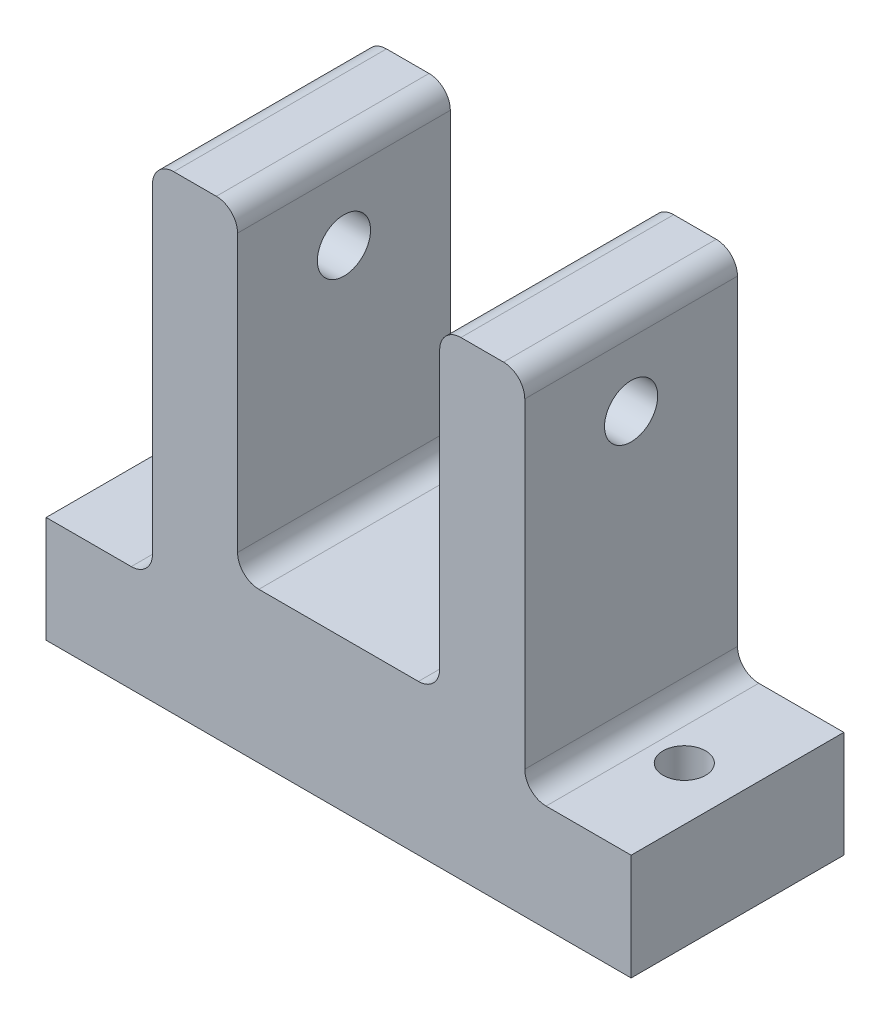
ISO-10303-21;
HEADER;
FILE_DESCRIPTION(('STEP AP214'),'2;1');
FILE_NAME('part.step','',(''),(''),'','','');
FILE_SCHEMA(('AUTOMOTIVE_DESIGN { 1 0 10303 214 1 1 1 1 }'));
ENDSEC;
DATA;
#1=APPLICATION_CONTEXT('core data for automotive mechanical design processes');
#2=APPLICATION_PROTOCOL_DEFINITION('international standard','automotive_design',2000,#1);
#3=PRODUCT_CONTEXT('',#1,'mechanical');
#4=PRODUCT('Part','Part','',(#3));
#5=PRODUCT_RELATED_PRODUCT_CATEGORY('part','',(#4));
#6=PRODUCT_DEFINITION_FORMATION('','',#4);
#7=PRODUCT_DEFINITION_CONTEXT('part definition',#1,'design');
#8=PRODUCT_DEFINITION('design','',#6,#7);
#9=PRODUCT_DEFINITION_SHAPE('','',#8);
#10=(LENGTH_UNIT() NAMED_UNIT(*) SI_UNIT(.MILLI.,.METRE.));
#11=(NAMED_UNIT(*) PLANE_ANGLE_UNIT() SI_UNIT($,.RADIAN.));
#12=(NAMED_UNIT(*) SI_UNIT($,.STERADIAN.) SOLID_ANGLE_UNIT());
#13=UNCERTAINTY_MEASURE_WITH_UNIT(LENGTH_MEASURE(1.E-05),#10,'distance_accuracy_value','');
#14=(GEOMETRIC_REPRESENTATION_CONTEXT(3) GLOBAL_UNCERTAINTY_ASSIGNED_CONTEXT((#13)) GLOBAL_UNIT_ASSIGNED_CONTEXT((#10,
#11,#12)) REPRESENTATION_CONTEXT('',''));
#15=CARTESIAN_POINT('',(0.,0.,0.));
#16=DIRECTION('',(0.,0.,1.));
#17=DIRECTION('',(1.,0.,0.));
#18=AXIS2_PLACEMENT_3D('',#15,#16,#17);
#19=CARTESIAN_POINT('',(0.,44.15,0.));
#20=DIRECTION('',(0.,-1.,0.));
#21=DIRECTION('',(0.,0.,-1.));
#22=AXIS2_PLACEMENT_3D('',#19,#20,#21);
#23=PLANE('',#22);
#24=DIRECTION('',(1.,0.,0.));
#25=VECTOR('',#24,1.);
#26=CARTESIAN_POINT('',(-17.5,44.15,10.));
#27=LINE('',#26,#25);
#28=CARTESIAN_POINT('',(11.5,44.15,10.));
#29=VERTEX_POINT('',#28);
#30=CARTESIAN_POINT('',(15.5,44.15,10.));
#31=VERTEX_POINT('',#30);
#32=EDGE_CURVE('E268',#29,#31,#27,.T.);
#33=ORIENTED_EDGE('',*,*,#32,.T.);
#34=DIRECTION('',(0.,0.,-1.));
#35=VECTOR('',#34,1.);
#36=CARTESIAN_POINT('',(15.5,44.15,0.));
#37=LINE('',#36,#35);
#38=CARTESIAN_POINT('',(15.5,44.15,-10.));
#39=VERTEX_POINT('',#38);
#40=EDGE_CURVE('E324',#31,#39,#37,.T.);
#41=ORIENTED_EDGE('',*,*,#40,.T.);
#42=DIRECTION('',(-1.,0.,0.));
#43=VECTOR('',#42,1.);
#44=CARTESIAN_POINT('',(-17.5,44.15,-10.));
#45=LINE('',#44,#43);
#46=CARTESIAN_POINT('',(11.5,44.15,-10.));
#47=VERTEX_POINT('',#46);
#48=EDGE_CURVE('E266',#39,#47,#45,.T.);
#49=ORIENTED_EDGE('',*,*,#48,.T.);
#50=DIRECTION('',(0.,0.,-1.));
#51=VECTOR('',#50,1.);
#52=CARTESIAN_POINT('',(11.5,44.15,0.));
#53=LINE('',#52,#51);
#54=EDGE_CURVE('E296',#47,#29,#53,.F.);
#55=ORIENTED_EDGE('',*,*,#54,.T.);
#56=EDGE_LOOP('',(#33,#41,#49,#55));
#57=FACE_BOUND('',#56,.T.);
#58=ADVANCED_FACE('F41',(#57),#23,.F.);
#59=CARTESIAN_POINT('',(17.5,44.15,10.));
#60=DIRECTION('',(-1.,0.,0.));
#61=DIRECTION('',(0.,0.,1.));
#62=AXIS2_PLACEMENT_3D('',#59,#60,#61);
#63=PLANE('',#62);
#64=CARTESIAN_POINT('',(17.5,36.15,0.));
#65=DIRECTION('',(-1.,0.,0.));
#66=DIRECTION('',(0.,0.,1.));
#67=AXIS2_PLACEMENT_3D('',#64,#65,#66);
#68=CIRCLE('',#67,2.5);
#69=CARTESIAN_POINT('',(17.5,36.15,2.5));
#70=VERTEX_POINT('',#69);
#71=EDGE_CURVE('E246',#70,#70,#68,.T.);
#72=ORIENTED_EDGE('',*,*,#71,.T.);
#73=EDGE_LOOP('',(#72));
#74=FACE_BOUND('',#73,.T.);
#75=DIRECTION('',(0.,-1.,0.));
#76=VECTOR('',#75,1.);
#77=CARTESIAN_POINT('',(17.5,44.15,-10.));
#78=LINE('',#77,#76);
#79=CARTESIAN_POINT('',(17.5,42.15,-10.));
#80=VERTEX_POINT('',#79);
#81=CARTESIAN_POINT('',(17.5,12.,-10.));
#82=VERTEX_POINT('',#81);
#83=EDGE_CURVE('E281',#80,#82,#78,.T.);
#84=ORIENTED_EDGE('',*,*,#83,.F.);
#85=DIRECTION('',(0.,0.,-1.));
#86=VECTOR('',#85,1.);
#87=CARTESIAN_POINT('',(17.5,42.15,10.));
#88=LINE('',#87,#86);
#89=CARTESIAN_POINT('',(17.5,42.15,10.));
#90=VERTEX_POINT('',#89);
#91=EDGE_CURVE('E334',#80,#90,#88,.F.);
#92=ORIENTED_EDGE('',*,*,#91,.T.);
#93=DIRECTION('',(0.,-1.,0.));
#94=VECTOR('',#93,1.);
#95=CARTESIAN_POINT('',(17.5,44.15,10.));
#96=LINE('',#95,#94);
#97=CARTESIAN_POINT('',(17.5,12.,10.));
#98=VERTEX_POINT('',#97);
#99=EDGE_CURVE('E271',#90,#98,#96,.T.);
#100=ORIENTED_EDGE('',*,*,#99,.T.);
#101=DIRECTION('',(0.,0.,-1.));
#102=VECTOR('',#101,1.);
#103=CARTESIAN_POINT('',(17.5,12.,-10.));
#104=LINE('',#103,#102);
#105=EDGE_CURVE('E331',#98,#82,#104,.T.);
#106=ORIENTED_EDGE('',*,*,#105,.T.);
#107=EDGE_LOOP('',(#84,#92,#100,#106));
#108=FACE_BOUND('',#107,.T.);
#109=ADVANCED_FACE('F362',(#74,#108),#63,.F.);
#110=CARTESIAN_POINT('',(-17.5,44.15,-10.));
#111=DIRECTION('',(0.,0.,1.));
#112=DIRECTION('',(1.,0.,0.));
#113=AXIS2_PLACEMENT_3D('',#110,#111,#112);
#114=PLANE('',#113);
#115=ORIENTED_EDGE('',*,*,#48,.F.);
#116=CARTESIAN_POINT('',(15.5,42.15,-10.));
#117=DIRECTION('',(0.,0.,1.));
#118=DIRECTION('',(1.,0.,0.));
#119=AXIS2_PLACEMENT_3D('',#116,#117,#118);
#120=CIRCLE('',#119,2.);
#121=EDGE_CURVE('E329',#39,#80,#120,.F.);
#122=ORIENTED_EDGE('',*,*,#121,.T.);
#123=ORIENTED_EDGE('',*,*,#83,.T.);
#124=CARTESIAN_POINT('',(19.5,12.,-10.));
#125=DIRECTION('',(0.,0.,1.));
#126=DIRECTION('',(1.,0.,0.));
#127=AXIS2_PLACEMENT_3D('',#124,#125,#126);
#128=CIRCLE('',#127,2.);
#129=CARTESIAN_POINT('',(19.5,10.,-10.));
#130=VERTEX_POINT('',#129);
#131=EDGE_CURVE('E351',#82,#130,#128,.T.);
#132=ORIENTED_EDGE('',*,*,#131,.T.);
#133=DIRECTION('',(1.,0.,0.));
#134=VECTOR('',#133,1.);
#135=CARTESIAN_POINT('',(17.5,10.,-10.));
#136=LINE('',#135,#134);
#137=CARTESIAN_POINT('',(27.5,10.,-10.));
#138=VERTEX_POINT('',#137);
#139=EDGE_CURVE('E227',#130,#138,#136,.T.);
#140=ORIENTED_EDGE('',*,*,#139,.T.);
#141=DIRECTION('',(0.,-1.,0.));
#142=VECTOR('',#141,1.);
#143=CARTESIAN_POINT('',(27.5,10.,-10.));
#144=LINE('',#143,#142);
#145=CARTESIAN_POINT('',(27.5,0.,-10.));
#146=VERTEX_POINT('',#145);
#147=EDGE_CURVE('E185',#138,#146,#144,.T.);
#148=ORIENTED_EDGE('',*,*,#147,.T.);
#149=DIRECTION('',(-1.,0.,0.));
#150=VECTOR('',#149,1.);
#151=CARTESIAN_POINT('',(-17.5,0.,-10.));
#152=LINE('',#151,#150);
#153=CARTESIAN_POINT('',(-27.5,0.,-10.));
#154=VERTEX_POINT('',#153);
#155=EDGE_CURVE('E177',#146,#154,#152,.T.);
#156=ORIENTED_EDGE('',*,*,#155,.T.);
#157=DIRECTION('',(0.,-1.,0.));
#158=VECTOR('',#157,1.);
#159=CARTESIAN_POINT('',(-27.5,10.,-10.));
#160=LINE('',#159,#158);
#161=CARTESIAN_POINT('',(-27.5,10.,-10.));
#162=VERTEX_POINT('',#161);
#163=EDGE_CURVE('E182',#162,#154,#160,.T.);
#164=ORIENTED_EDGE('',*,*,#163,.F.);
#165=DIRECTION('',(1.,0.,0.));
#166=VECTOR('',#165,1.);
#167=CARTESIAN_POINT('',(-17.5,10.,-10.));
#168=LINE('',#167,#166);
#169=CARTESIAN_POINT('',(-19.5,10.,-10.));
#170=VERTEX_POINT('',#169);
#171=EDGE_CURVE('E215',#162,#170,#168,.T.);
#172=ORIENTED_EDGE('',*,*,#171,.T.);
#173=CARTESIAN_POINT('',(-19.5,12.,-10.));
#174=DIRECTION('',(0.,0.,1.));
#175=DIRECTION('',(1.,0.,0.));
#176=AXIS2_PLACEMENT_3D('',#173,#174,#175);
#177=CIRCLE('',#176,2.);
#178=CARTESIAN_POINT('',(-17.5,12.,-10.));
#179=VERTEX_POINT('',#178);
#180=EDGE_CURVE('E11',#170,#179,#177,.T.);
#181=ORIENTED_EDGE('',*,*,#180,.T.);
#182=DIRECTION('',(0.,-1.,0.));
#183=VECTOR('',#182,1.);
#184=CARTESIAN_POINT('',(-17.5,44.15,-10.));
#185=LINE('',#184,#183);
#186=CARTESIAN_POINT('',(-17.5,42.15,-10.));
#187=VERTEX_POINT('',#186);
#188=EDGE_CURVE('E278',#187,#179,#185,.T.);
#189=ORIENTED_EDGE('',*,*,#188,.F.);
#190=CARTESIAN_POINT('',(-15.5,42.15,-10.));
#191=DIRECTION('',(0.,0.,1.));
#192=DIRECTION('',(1.,0.,0.));
#193=AXIS2_PLACEMENT_3D('',#190,#191,#192);
#194=CIRCLE('',#193,2.);
#195=CARTESIAN_POINT('',(-15.5,44.15,-10.));
#196=VERTEX_POINT('',#195);
#197=EDGE_CURVE('E327',#187,#196,#194,.F.);
#198=ORIENTED_EDGE('',*,*,#197,.T.);
#199=CARTESIAN_POINT('',(-11.5,44.15,-10.));
#200=VERTEX_POINT('',#199);
#201=EDGE_CURVE('E269',#200,#196,#45,.T.);
#202=ORIENTED_EDGE('',*,*,#201,.F.);
#203=CARTESIAN_POINT('',(-11.5,42.15,-10.));
#204=DIRECTION('',(0.,0.,1.));
#205=DIRECTION('',(1.,0.,0.));
#206=AXIS2_PLACEMENT_3D('',#203,#204,#205);
#207=CIRCLE('',#206,2.);
#208=CARTESIAN_POINT('',(-9.5,42.15,-10.));
#209=VERTEX_POINT('',#208);
#210=EDGE_CURVE('E291',#200,#209,#207,.F.);
#211=ORIENTED_EDGE('',*,*,#210,.T.);
#212=DIRECTION('',(0.,1.,0.));
#213=VECTOR('',#212,1.);
#214=CARTESIAN_POINT('',(-9.5,14.15,-10.));
#215=LINE('',#214,#213);
#216=CARTESIAN_POINT('',(-9.5,16.15,-10.));
#217=VERTEX_POINT('',#216);
#218=EDGE_CURVE('E261',#217,#209,#215,.T.);
#219=ORIENTED_EDGE('',*,*,#218,.F.);
#220=CARTESIAN_POINT('',(-7.5,16.15,-10.));
#221=DIRECTION('',(0.,0.,1.));
#222=DIRECTION('',(1.,0.,0.));
#223=AXIS2_PLACEMENT_3D('',#220,#221,#222);
#224=CIRCLE('',#223,2.);
#225=CARTESIAN_POINT('',(-7.5,14.15,-10.));
#226=VERTEX_POINT('',#225);
#227=EDGE_CURVE('E322',#217,#226,#224,.T.);
#228=ORIENTED_EDGE('',*,*,#227,.T.);
#229=DIRECTION('',(-1.,0.,0.));
#230=VECTOR('',#229,1.);
#231=CARTESIAN_POINT('',(-9.5,14.15,-10.));
#232=LINE('',#231,#230);
#233=CARTESIAN_POINT('',(7.5,14.15,-10.));
#234=VERTEX_POINT('',#233);
#235=EDGE_CURVE('E249',#234,#226,#232,.T.);
#236=ORIENTED_EDGE('',*,*,#235,.F.);
#237=CARTESIAN_POINT('',(7.5,16.15,-10.));
#238=DIRECTION('',(0.,0.,1.));
#239=DIRECTION('',(1.,0.,0.));
#240=AXIS2_PLACEMENT_3D('',#237,#238,#239);
#241=CIRCLE('',#240,2.);
#242=CARTESIAN_POINT('',(9.5,16.15,-10.));
#243=VERTEX_POINT('',#242);
#244=EDGE_CURVE('E316',#234,#243,#241,.T.);
#245=ORIENTED_EDGE('',*,*,#244,.T.);
#246=DIRECTION('',(0.,1.,0.));
#247=VECTOR('',#246,1.);
#248=CARTESIAN_POINT('',(9.5,14.15,-10.));
#249=LINE('',#248,#247);
#250=CARTESIAN_POINT('',(9.5,42.15,-10.));
#251=VERTEX_POINT('',#250);
#252=EDGE_CURVE('E255',#243,#251,#249,.T.);
#253=ORIENTED_EDGE('',*,*,#252,.T.);
#254=CARTESIAN_POINT('',(11.5,42.15,-10.));
#255=DIRECTION('',(0.,0.,1.));
#256=DIRECTION('',(1.,0.,0.));
#257=AXIS2_PLACEMENT_3D('',#254,#255,#256);
#258=CIRCLE('',#257,2.);
#259=EDGE_CURVE('E293',#251,#47,#258,.F.);
#260=ORIENTED_EDGE('',*,*,#259,.T.);
#261=EDGE_LOOP('',(#115,#122,#123,#132,#140,#148,#156,#164,#172,#181,#189,#198,#202,#211,#219,
#228,#236,#245,#253,#260));
#262=FACE_BOUND('',#261,.T.);
#263=ADVANCED_FACE('F180',(#262),#114,.F.);
#264=CARTESIAN_POINT('',(-17.5,44.15,10.));
#265=DIRECTION('',(1.,0.,0.));
#266=DIRECTION('',(0.,0.,-1.));
#267=AXIS2_PLACEMENT_3D('',#264,#265,#266);
#268=PLANE('',#267);
#269=CARTESIAN_POINT('',(-17.5,36.15,0.));
#270=DIRECTION('',(1.,0.,0.));
#271=DIRECTION('',(0.,0.,-1.));
#272=AXIS2_PLACEMENT_3D('',#269,#270,#271);
#273=CIRCLE('',#272,2.5);
#274=CARTESIAN_POINT('',(-17.5,36.15,-2.5));
#275=VERTEX_POINT('',#274);
#276=EDGE_CURVE('E238',#275,#275,#273,.T.);
#277=ORIENTED_EDGE('',*,*,#276,.T.);
#278=EDGE_LOOP('',(#277));
#279=FACE_BOUND('',#278,.T.);
#280=DIRECTION('',(0.,-1.,0.));
#281=VECTOR('',#280,1.);
#282=CARTESIAN_POINT('',(-17.5,44.15,10.));
#283=LINE('',#282,#281);
#284=CARTESIAN_POINT('',(-17.5,42.15,10.));
#285=VERTEX_POINT('',#284);
#286=CARTESIAN_POINT('',(-17.5,12.,10.));
#287=VERTEX_POINT('',#286);
#288=EDGE_CURVE('E276',#285,#287,#283,.T.);
#289=ORIENTED_EDGE('',*,*,#288,.F.);
#290=DIRECTION('',(0.,0.,1.));
#291=VECTOR('',#290,1.);
#292=CARTESIAN_POINT('',(-17.5,42.15,10.));
#293=LINE('',#292,#291);
#294=EDGE_CURVE('E346',#285,#187,#293,.F.);
#295=ORIENTED_EDGE('',*,*,#294,.T.);
#296=ORIENTED_EDGE('',*,*,#188,.T.);
#297=DIRECTION('',(0.,0.,1.));
#298=VECTOR('',#297,1.);
#299=CARTESIAN_POINT('',(-17.5,12.,10.));
#300=LINE('',#299,#298);
#301=EDGE_CURVE('E343',#179,#287,#300,.T.);
#302=ORIENTED_EDGE('',*,*,#301,.T.);
#303=EDGE_LOOP('',(#289,#295,#296,#302));
#304=FACE_BOUND('',#303,.T.);
#305=ADVANCED_FACE('F378',(#279,#304),#268,.F.);
#306=CARTESIAN_POINT('',(-17.5,44.15,10.));
#307=DIRECTION('',(0.,0.,-1.));
#308=DIRECTION('',(-1.,0.,0.));
#309=AXIS2_PLACEMENT_3D('',#306,#307,#308);
#310=PLANE('',#309);
#311=ORIENTED_EDGE('',*,*,#99,.F.);
#312=CARTESIAN_POINT('',(15.5,42.15,10.));
#313=DIRECTION('',(0.,0.,-1.));
#314=DIRECTION('',(-1.,0.,0.));
#315=AXIS2_PLACEMENT_3D('',#312,#313,#314);
#316=CIRCLE('',#315,2.);
#317=EDGE_CURVE('E338',#90,#31,#316,.F.);
#318=ORIENTED_EDGE('',*,*,#317,.T.);
#319=ORIENTED_EDGE('',*,*,#32,.F.);
#320=CARTESIAN_POINT('',(11.5,42.15,10.));
#321=DIRECTION('',(0.,0.,-1.));
#322=DIRECTION('',(-1.,0.,0.));
#323=AXIS2_PLACEMENT_3D('',#320,#321,#322);
#324=CIRCLE('',#323,2.);
#325=CARTESIAN_POINT('',(9.5,42.15,10.));
#326=VERTEX_POINT('',#325);
#327=EDGE_CURVE('E301',#29,#326,#324,.F.);
#328=ORIENTED_EDGE('',*,*,#327,.T.);
#329=DIRECTION('',(0.,1.,0.));
#330=VECTOR('',#329,1.);
#331=CARTESIAN_POINT('',(9.5,14.15,10.));
#332=LINE('',#331,#330);
#333=CARTESIAN_POINT('',(9.5,16.15,10.));
#334=VERTEX_POINT('',#333);
#335=EDGE_CURVE('E191',#334,#326,#332,.T.);
#336=ORIENTED_EDGE('',*,*,#335,.F.);
#337=CARTESIAN_POINT('',(7.5,16.15,10.));
#338=DIRECTION('',(0.,0.,-1.));
#339=DIRECTION('',(-1.,0.,0.));
#340=AXIS2_PLACEMENT_3D('',#337,#338,#339);
#341=CIRCLE('',#340,2.);
#342=CARTESIAN_POINT('',(7.5,14.15,10.));
#343=VERTEX_POINT('',#342);
#344=EDGE_CURVE('E318',#334,#343,#341,.T.);
#345=ORIENTED_EDGE('',*,*,#344,.T.);
#346=DIRECTION('',(1.,0.,0.));
#347=VECTOR('',#346,1.);
#348=CARTESIAN_POINT('',(-9.5,14.15,10.));
#349=LINE('',#348,#347);
#350=CARTESIAN_POINT('',(-7.5,14.15,10.));
#351=VERTEX_POINT('',#350);
#352=EDGE_CURVE('E252',#351,#343,#349,.T.);
#353=ORIENTED_EDGE('',*,*,#352,.F.);
#354=CARTESIAN_POINT('',(-7.5,16.15,10.));
#355=DIRECTION('',(0.,0.,-1.));
#356=DIRECTION('',(-1.,0.,0.));
#357=AXIS2_PLACEMENT_3D('',#354,#355,#356);
#358=CIRCLE('',#357,2.);
#359=CARTESIAN_POINT('',(-9.5,16.15,10.));
#360=VERTEX_POINT('',#359);
#361=EDGE_CURVE('E320',#351,#360,#358,.T.);
#362=ORIENTED_EDGE('',*,*,#361,.T.);
#363=DIRECTION('',(0.,1.,0.));
#364=VECTOR('',#363,1.);
#365=CARTESIAN_POINT('',(-9.5,14.15,10.));
#366=LINE('',#365,#364);
#367=CARTESIAN_POINT('',(-9.5,42.15,10.));
#368=VERTEX_POINT('',#367);
#369=EDGE_CURVE('E258',#360,#368,#366,.T.);
#370=ORIENTED_EDGE('',*,*,#369,.T.);
#371=CARTESIAN_POINT('',(-11.5,42.15,10.));
#372=DIRECTION('',(0.,0.,-1.));
#373=DIRECTION('',(-1.,0.,0.));
#374=AXIS2_PLACEMENT_3D('',#371,#372,#373);
#375=CIRCLE('',#374,2.);
#376=CARTESIAN_POINT('',(-11.5,44.15,10.));
#377=VERTEX_POINT('',#376);
#378=EDGE_CURVE('E298',#368,#377,#375,.F.);
#379=ORIENTED_EDGE('',*,*,#378,.T.);
#380=CARTESIAN_POINT('',(-15.5,44.15,10.));
#381=VERTEX_POINT('',#380);
#382=EDGE_CURVE('E270',#381,#377,#27,.T.);
#383=ORIENTED_EDGE('',*,*,#382,.F.);
#384=CARTESIAN_POINT('',(-15.5,42.15,10.));
#385=DIRECTION('',(0.,0.,-1.));
#386=DIRECTION('',(-1.,0.,0.));
#387=AXIS2_PLACEMENT_3D('',#384,#385,#386);
#388=CIRCLE('',#387,2.);
#389=EDGE_CURVE('E336',#381,#285,#388,.F.);
#390=ORIENTED_EDGE('',*,*,#389,.T.);
#391=ORIENTED_EDGE('',*,*,#288,.T.);
#392=CARTESIAN_POINT('',(-19.5,12.,10.));
#393=DIRECTION('',(0.,0.,-1.));
#394=DIRECTION('',(-1.,0.,0.));
#395=AXIS2_PLACEMENT_3D('',#392,#393,#394);
#396=CIRCLE('',#395,2.);
#397=CARTESIAN_POINT('',(-19.5,10.,10.));
#398=VERTEX_POINT('',#397);
#399=EDGE_CURVE('E49',#287,#398,#396,.T.);
#400=ORIENTED_EDGE('',*,*,#399,.T.);
#401=DIRECTION('',(-1.,0.,0.));
#402=VECTOR('',#401,1.);
#403=CARTESIAN_POINT('',(-17.5,10.,10.));
#404=LINE('',#403,#402);
#405=CARTESIAN_POINT('',(-27.5,10.,10.));
#406=VERTEX_POINT('',#405);
#407=EDGE_CURVE('E207',#398,#406,#404,.T.);
#408=ORIENTED_EDGE('',*,*,#407,.T.);
#409=DIRECTION('',(0.,-1.,0.));
#410=VECTOR('',#409,1.);
#411=CARTESIAN_POINT('',(-27.5,10.,10.));
#412=LINE('',#411,#410);
#413=CARTESIAN_POINT('',(-27.5,0.,10.));
#414=VERTEX_POINT('',#413);
#415=EDGE_CURVE('E201',#406,#414,#412,.T.);
#416=ORIENTED_EDGE('',*,*,#415,.T.);
#417=DIRECTION('',(1.,0.,0.));
#418=VECTOR('',#417,1.);
#419=CARTESIAN_POINT('',(-17.5,0.,10.));
#420=LINE('',#419,#418);
#421=CARTESIAN_POINT('',(27.5,0.,10.));
#422=VERTEX_POINT('',#421);
#423=EDGE_CURVE('E190',#414,#422,#420,.T.);
#424=ORIENTED_EDGE('',*,*,#423,.T.);
#425=DIRECTION('',(0.,-1.,0.));
#426=VECTOR('',#425,1.);
#427=CARTESIAN_POINT('',(27.5,10.,10.));
#428=LINE('',#427,#426);
#429=CARTESIAN_POINT('',(27.5,10.,10.));
#430=VERTEX_POINT('',#429);
#431=EDGE_CURVE('E235',#430,#422,#428,.T.);
#432=ORIENTED_EDGE('',*,*,#431,.F.);
#433=DIRECTION('',(-1.,0.,0.));
#434=VECTOR('',#433,1.);
#435=CARTESIAN_POINT('',(17.5,10.,10.));
#436=LINE('',#435,#434);
#437=CARTESIAN_POINT('',(19.5,10.,10.));
#438=VERTEX_POINT('',#437);
#439=EDGE_CURVE('E232',#430,#438,#436,.T.);
#440=ORIENTED_EDGE('',*,*,#439,.T.);
#441=CARTESIAN_POINT('',(19.5,12.,10.));
#442=DIRECTION('',(0.,0.,-1.));
#443=DIRECTION('',(-1.,0.,0.));
#444=AXIS2_PLACEMENT_3D('',#441,#442,#443);
#445=CIRCLE('',#444,2.);
#446=EDGE_CURVE('E353',#438,#98,#445,.T.);
#447=ORIENTED_EDGE('',*,*,#446,.T.);
#448=EDGE_LOOP('',(#311,#318,#319,#328,#336,#345,#353,#362,#370,#379,#383,#390,#391,#400,#408,
#416,#424,#432,#440,#447));
#449=FACE_BOUND('',#448,.T.);
#450=ADVANCED_FACE('F356',(#449),#310,.F.);
#451=ORIENTED_EDGE('',*,*,#201,.T.);
#452=DIRECTION('',(0.,0.,1.));
#453=VECTOR('',#452,1.);
#454=CARTESIAN_POINT('',(-15.5,44.15,0.));
#455=LINE('',#454,#453);
#456=EDGE_CURVE('E340',#196,#381,#455,.T.);
#457=ORIENTED_EDGE('',*,*,#456,.T.);
#458=ORIENTED_EDGE('',*,*,#382,.T.);
#459=DIRECTION('',(0.,0.,1.));
#460=VECTOR('',#459,1.);
#461=CARTESIAN_POINT('',(-11.5,44.15,0.));
#462=LINE('',#461,#460);
#463=EDGE_CURVE('E308',#377,#200,#462,.F.);
#464=ORIENTED_EDGE('',*,*,#463,.T.);
#465=EDGE_LOOP('',(#451,#457,#458,#464));
#466=FACE_BOUND('',#465,.T.);
#467=ADVANCED_FACE('F387',(#466),#23,.F.);
#468=CARTESIAN_POINT('',(0.,0.,0.));
#469=DIRECTION('',(0.,-1.,0.));
#470=DIRECTION('',(0.,0.,-1.));
#471=AXIS2_PLACEMENT_3D('',#468,#469,#470);
#472=PLANE('',#471);
#473=ORIENTED_EDGE('',*,*,#155,.F.);
#474=DIRECTION('',(0.,0.,1.));
#475=VECTOR('',#474,1.);
#476=CARTESIAN_POINT('',(27.5,0.,10.));
#477=LINE('',#476,#475);
#478=EDGE_CURVE('E224',#146,#422,#477,.T.);
#479=ORIENTED_EDGE('',*,*,#478,.T.);
#480=ORIENTED_EDGE('',*,*,#423,.F.);
#481=DIRECTION('',(0.,0.,-1.));
#482=VECTOR('',#481,1.);
#483=CARTESIAN_POINT('',(-27.5,0.,10.));
#484=LINE('',#483,#482);
#485=EDGE_CURVE('E198',#414,#154,#484,.T.);
#486=ORIENTED_EDGE('',*,*,#485,.T.);
#487=EDGE_LOOP('',(#473,#479,#480,#486));
#488=FACE_BOUND('',#487,.T.);
#489=CARTESIAN_POINT('',(22.5,0.,0.));
#490=DIRECTION('',(0.,-1.,0.));
#491=DIRECTION('',(0.,0.,-1.));
#492=AXIS2_PLACEMENT_3D('',#489,#490,#491);
#493=CIRCLE('',#492,2.);
#494=CARTESIAN_POINT('',(22.5,0.,-2.));
#495=VERTEX_POINT('',#494);
#496=EDGE_CURVE('E219',#495,#495,#493,.T.);
#497=ORIENTED_EDGE('',*,*,#496,.F.);
#498=EDGE_LOOP('',(#497));
#499=FACE_BOUND('',#498,.T.);
#500=CARTESIAN_POINT('',(-22.5,0.,0.));
#501=DIRECTION('',(0.,-1.,0.));
#502=DIRECTION('',(0.,0.,1.));
#503=AXIS2_PLACEMENT_3D('',#500,#501,#502);
#504=CIRCLE('',#503,2.);
#505=CARTESIAN_POINT('',(-22.5,0.,2.));
#506=VERTEX_POINT('',#505);
#507=EDGE_CURVE('E210',#506,#506,#504,.T.);
#508=ORIENTED_EDGE('',*,*,#507,.F.);
#509=EDGE_LOOP('',(#508));
#510=FACE_BOUND('',#509,.T.);
#511=ADVANCED_FACE('F203',(#488,#499,#510),#472,.T.);
#512=CARTESIAN_POINT('',(9.5,14.15,10.));
#513=DIRECTION('',(1.,0.,0.));
#514=DIRECTION('',(0.,0.,-1.));
#515=AXIS2_PLACEMENT_3D('',#512,#513,#514);
#516=PLANE('',#515);
#517=CARTESIAN_POINT('',(9.5,36.15,0.));
#518=DIRECTION('',(1.,0.,0.));
#519=DIRECTION('',(0.,0.,-1.));
#520=AXIS2_PLACEMENT_3D('',#517,#518,#519);
#521=CIRCLE('',#520,2.5);
#522=CARTESIAN_POINT('',(9.5,36.15,-2.5));
#523=VERTEX_POINT('',#522);
#524=EDGE_CURVE('E243',#523,#523,#521,.T.);
#525=ORIENTED_EDGE('',*,*,#524,.T.);
#526=EDGE_LOOP('',(#525));
#527=FACE_BOUND('',#526,.T.);
#528=ORIENTED_EDGE('',*,*,#335,.T.);
#529=DIRECTION('',(0.,0.,-1.));
#530=VECTOR('',#529,1.);
#531=CARTESIAN_POINT('',(9.5,42.15,10.));
#532=LINE('',#531,#530);
#533=EDGE_CURVE('E288',#326,#251,#532,.T.);
#534=ORIENTED_EDGE('',*,*,#533,.T.);
#535=ORIENTED_EDGE('',*,*,#252,.F.);
#536=DIRECTION('',(0.,0.,-1.));
#537=VECTOR('',#536,1.);
#538=CARTESIAN_POINT('',(9.5,16.15,10.));
#539=LINE('',#538,#537);
#540=EDGE_CURVE('E284',#243,#334,#539,.F.);
#541=ORIENTED_EDGE('',*,*,#540,.T.);
#542=EDGE_LOOP('',(#528,#534,#535,#541));
#543=FACE_BOUND('',#542,.T.);
#544=ADVANCED_FACE('F412',(#527,#543),#516,.F.);
#545=CARTESIAN_POINT('',(-9.5,14.15,10.));
#546=DIRECTION('',(-1.,0.,0.));
#547=DIRECTION('',(0.,0.,1.));
#548=AXIS2_PLACEMENT_3D('',#545,#546,#547);
#549=PLANE('',#548);
#550=CARTESIAN_POINT('',(-9.5,36.15,0.));
#551=DIRECTION('',(-1.,0.,0.));
#552=DIRECTION('',(0.,0.,1.));
#553=AXIS2_PLACEMENT_3D('',#550,#551,#552);
#554=CIRCLE('',#553,2.5);
#555=CARTESIAN_POINT('',(-9.5,36.15,2.5));
#556=VERTEX_POINT('',#555);
#557=EDGE_CURVE('E242',#556,#556,#554,.T.);
#558=ORIENTED_EDGE('',*,*,#557,.T.);
#559=EDGE_LOOP('',(#558));
#560=FACE_BOUND('',#559,.T.);
#561=ORIENTED_EDGE('',*,*,#218,.T.);
#562=DIRECTION('',(0.,0.,1.));
#563=VECTOR('',#562,1.);
#564=CARTESIAN_POINT('',(-9.5,42.15,10.));
#565=LINE('',#564,#563);
#566=EDGE_CURVE('E305',#209,#368,#565,.T.);
#567=ORIENTED_EDGE('',*,*,#566,.T.);
#568=ORIENTED_EDGE('',*,*,#369,.F.);
#569=DIRECTION('',(0.,0.,1.));
#570=VECTOR('',#569,1.);
#571=CARTESIAN_POINT('',(-9.5,16.15,-10.));
#572=LINE('',#571,#570);
#573=EDGE_CURVE('E303',#360,#217,#572,.F.);
#574=ORIENTED_EDGE('',*,*,#573,.T.);
#575=EDGE_LOOP('',(#561,#567,#568,#574));
#576=FACE_BOUND('',#575,.T.);
#577=ADVANCED_FACE('F397',(#560,#576),#549,.F.);
#578=CARTESIAN_POINT('',(0.,14.15,0.));
#579=DIRECTION('',(0.,-1.,0.));
#580=DIRECTION('',(0.,0.,-1.));
#581=AXIS2_PLACEMENT_3D('',#578,#579,#580);
#582=PLANE('',#581);
#583=ORIENTED_EDGE('',*,*,#352,.T.);
#584=DIRECTION('',(0.,0.,-1.));
#585=VECTOR('',#584,1.);
#586=CARTESIAN_POINT('',(7.5,14.15,-10.));
#587=LINE('',#586,#585);
#588=EDGE_CURVE('E313',#343,#234,#587,.T.);
#589=ORIENTED_EDGE('',*,*,#588,.T.);
#590=ORIENTED_EDGE('',*,*,#235,.T.);
#591=DIRECTION('',(0.,0.,1.));
#592=VECTOR('',#591,1.);
#593=CARTESIAN_POINT('',(-7.5,14.15,10.));
#594=LINE('',#593,#592);
#595=EDGE_CURVE('E310',#226,#351,#594,.T.);
#596=ORIENTED_EDGE('',*,*,#595,.T.);
#597=EDGE_LOOP('',(#583,#589,#590,#596));
#598=FACE_BOUND('',#597,.T.);
#599=ADVANCED_FACE('F405',(#598),#582,.F.);
#600=CARTESIAN_POINT('',(-17.5,36.15,0.));
#601=DIRECTION('',(1.,0.,0.));
#602=DIRECTION('',(0.,0.,-1.));
#603=AXIS2_PLACEMENT_3D('',#600,#601,#602);
#604=CYLINDRICAL_SURFACE('',#603,2.5);
#605=ORIENTED_EDGE('',*,*,#276,.F.);
#606=EDGE_LOOP('',(#605));
#607=FACE_BOUND('',#606,.T.);
#608=ORIENTED_EDGE('',*,*,#557,.F.);
#609=EDGE_LOOP('',(#608));
#610=FACE_BOUND('',#609,.T.);
#611=ADVANCED_FACE('F482',(#607,#610),#604,.F.);
#612=ORIENTED_EDGE('',*,*,#524,.F.);
#613=EDGE_LOOP('',(#612));
#614=FACE_BOUND('',#613,.T.);
#615=ORIENTED_EDGE('',*,*,#71,.F.);
#616=EDGE_LOOP('',(#615));
#617=FACE_BOUND('',#616,.T.);
#618=ADVANCED_FACE('F463',(#614,#617),#604,.F.);
#619=CARTESIAN_POINT('',(11.5,42.15,10.));
#620=DIRECTION('',(0.,0.,-1.));
#621=DIRECTION('',(-1.,0.,0.));
#622=AXIS2_PLACEMENT_3D('',#619,#620,#621);
#623=CYLINDRICAL_SURFACE('',#622,2.);
#624=ORIENTED_EDGE('',*,*,#327,.F.);
#625=ORIENTED_EDGE('',*,*,#54,.F.);
#626=ORIENTED_EDGE('',*,*,#259,.F.);
#627=ORIENTED_EDGE('',*,*,#533,.F.);
#628=EDGE_LOOP('',(#624,#625,#626,#627));
#629=FACE_BOUND('',#628,.T.);
#630=ADVANCED_FACE('F420',(#629),#623,.T.);
#631=CARTESIAN_POINT('',(-11.5,42.15,10.));
#632=DIRECTION('',(0.,0.,1.));
#633=DIRECTION('',(1.,0.,0.));
#634=AXIS2_PLACEMENT_3D('',#631,#632,#633);
#635=CYLINDRICAL_SURFACE('',#634,2.);
#636=ORIENTED_EDGE('',*,*,#210,.F.);
#637=ORIENTED_EDGE('',*,*,#463,.F.);
#638=ORIENTED_EDGE('',*,*,#378,.F.);
#639=ORIENTED_EDGE('',*,*,#566,.F.);
#640=EDGE_LOOP('',(#636,#637,#638,#639));
#641=FACE_BOUND('',#640,.T.);
#642=ADVANCED_FACE('F394',(#641),#635,.T.);
#643=CARTESIAN_POINT('',(7.5,16.15,0.));
#644=DIRECTION('',(0.,0.,1.));
#645=DIRECTION('',(1.,0.,0.));
#646=AXIS2_PLACEMENT_3D('',#643,#644,#645);
#647=CYLINDRICAL_SURFACE('',#646,2.);
#648=ORIENTED_EDGE('',*,*,#344,.F.);
#649=ORIENTED_EDGE('',*,*,#540,.F.);
#650=ORIENTED_EDGE('',*,*,#244,.F.);
#651=ORIENTED_EDGE('',*,*,#588,.F.);
#652=EDGE_LOOP('',(#648,#649,#650,#651));
#653=FACE_BOUND('',#652,.T.);
#654=ADVANCED_FACE('F416',(#653),#647,.F.);
#655=CARTESIAN_POINT('',(-7.5,16.15,0.));
#656=DIRECTION('',(0.,0.,-1.));
#657=DIRECTION('',(-1.,0.,0.));
#658=AXIS2_PLACEMENT_3D('',#655,#656,#657);
#659=CYLINDRICAL_SURFACE('',#658,2.);
#660=ORIENTED_EDGE('',*,*,#227,.F.);
#661=ORIENTED_EDGE('',*,*,#573,.F.);
#662=ORIENTED_EDGE('',*,*,#361,.F.);
#663=ORIENTED_EDGE('',*,*,#595,.F.);
#664=EDGE_LOOP('',(#660,#661,#662,#663));
#665=FACE_BOUND('',#664,.T.);
#666=ADVANCED_FACE('F403',(#665),#659,.F.);
#667=CARTESIAN_POINT('',(27.5,10.,10.));
#668=DIRECTION('',(1.,0.,0.));
#669=DIRECTION('',(0.,0.,-1.));
#670=AXIS2_PLACEMENT_3D('',#667,#668,#669);
#671=PLANE('',#670);
#672=ORIENTED_EDGE('',*,*,#478,.F.);
#673=ORIENTED_EDGE('',*,*,#147,.F.);
#674=DIRECTION('',(0.,0.,1.));
#675=VECTOR('',#674,1.);
#676=CARTESIAN_POINT('',(27.5,10.,10.));
#677=LINE('',#676,#675);
#678=EDGE_CURVE('E229',#138,#430,#677,.T.);
#679=ORIENTED_EDGE('',*,*,#678,.T.);
#680=ORIENTED_EDGE('',*,*,#431,.T.);
#681=EDGE_LOOP('',(#672,#673,#679,#680));
#682=FACE_BOUND('',#681,.T.);
#683=ADVANCED_FACE('F368',(#682),#671,.T.);
#684=CARTESIAN_POINT('',(0.,10.,0.));
#685=DIRECTION('',(0.,-1.,0.));
#686=DIRECTION('',(0.,0.,-1.));
#687=AXIS2_PLACEMENT_3D('',#684,#685,#686);
#688=PLANE('',#687);
#689=CARTESIAN_POINT('',(22.5,10.,0.));
#690=DIRECTION('',(0.,-1.,0.));
#691=DIRECTION('',(0.,0.,-1.));
#692=AXIS2_PLACEMENT_3D('',#689,#690,#691);
#693=CIRCLE('',#692,2.);
#694=CARTESIAN_POINT('',(22.5,10.,-2.));
#695=VERTEX_POINT('',#694);
#696=EDGE_CURVE('E221',#695,#695,#693,.T.);
#697=ORIENTED_EDGE('',*,*,#696,.T.);
#698=EDGE_LOOP('',(#697));
#699=FACE_BOUND('',#698,.T.);
#700=ORIENTED_EDGE('',*,*,#139,.F.);
#701=DIRECTION('',(0.,0.,-1.));
#702=VECTOR('',#701,1.);
#703=CARTESIAN_POINT('',(19.5,10.,10.));
#704=LINE('',#703,#702);
#705=EDGE_CURVE('E56',#130,#438,#704,.F.);
#706=ORIENTED_EDGE('',*,*,#705,.T.);
#707=ORIENTED_EDGE('',*,*,#439,.F.);
#708=ORIENTED_EDGE('',*,*,#678,.F.);
#709=EDGE_LOOP('',(#700,#706,#707,#708));
#710=FACE_BOUND('',#709,.T.);
#711=ADVANCED_FACE('F366',(#699,#710),#688,.F.);
#712=CARTESIAN_POINT('',(22.5,10.,0.));
#713=DIRECTION('',(0.,-1.,0.));
#714=DIRECTION('',(0.,0.,-1.));
#715=AXIS2_PLACEMENT_3D('',#712,#713,#714);
#716=CYLINDRICAL_SURFACE('',#715,2.);
#717=ORIENTED_EDGE('',*,*,#696,.F.);
#718=EDGE_LOOP('',(#717));
#719=FACE_BOUND('',#718,.T.);
#720=ORIENTED_EDGE('',*,*,#496,.T.);
#721=EDGE_LOOP('',(#720));
#722=FACE_BOUND('',#721,.T.);
#723=ADVANCED_FACE('F475',(#719,#722),#716,.F.);
#724=CARTESIAN_POINT('',(-27.5,10.,10.));
#725=DIRECTION('',(-1.,0.,0.));
#726=DIRECTION('',(0.,0.,1.));
#727=AXIS2_PLACEMENT_3D('',#724,#725,#726);
#728=PLANE('',#727);
#729=ORIENTED_EDGE('',*,*,#485,.F.);
#730=ORIENTED_EDGE('',*,*,#415,.F.);
#731=DIRECTION('',(0.,0.,-1.));
#732=VECTOR('',#731,1.);
#733=CARTESIAN_POINT('',(-27.5,10.,10.));
#734=LINE('',#733,#732);
#735=EDGE_CURVE('E200',#406,#162,#734,.T.);
#736=ORIENTED_EDGE('',*,*,#735,.T.);
#737=ORIENTED_EDGE('',*,*,#163,.T.);
#738=EDGE_LOOP('',(#729,#730,#736,#737));
#739=FACE_BOUND('',#738,.T.);
#740=ADVANCED_FACE('F196',(#739),#728,.T.);
#741=CARTESIAN_POINT('',(0.,10.,0.));
#742=DIRECTION('',(0.,-1.,0.));
#743=DIRECTION('',(0.,0.,-1.));
#744=AXIS2_PLACEMENT_3D('',#741,#742,#743);
#745=PLANE('',#744);
#746=CARTESIAN_POINT('',(-22.5,10.,0.));
#747=DIRECTION('',(0.,-1.,0.));
#748=DIRECTION('',(0.,0.,1.));
#749=AXIS2_PLACEMENT_3D('',#746,#747,#748);
#750=CIRCLE('',#749,2.);
#751=CARTESIAN_POINT('',(-22.5,10.,2.));
#752=VERTEX_POINT('',#751);
#753=EDGE_CURVE('E206',#752,#752,#750,.T.);
#754=ORIENTED_EDGE('',*,*,#753,.T.);
#755=EDGE_LOOP('',(#754));
#756=FACE_BOUND('',#755,.T.);
#757=ORIENTED_EDGE('',*,*,#407,.F.);
#758=DIRECTION('',(0.,0.,1.));
#759=VECTOR('',#758,1.);
#760=CARTESIAN_POINT('',(-19.5,10.,-10.));
#761=LINE('',#760,#759);
#762=EDGE_CURVE('E349',#398,#170,#761,.F.);
#763=ORIENTED_EDGE('',*,*,#762,.T.);
#764=ORIENTED_EDGE('',*,*,#171,.F.);
#765=ORIENTED_EDGE('',*,*,#735,.F.);
#766=EDGE_LOOP('',(#757,#763,#764,#765));
#767=FACE_BOUND('',#766,.T.);
#768=ADVANCED_FACE('F370',(#756,#767),#745,.F.);
#769=CARTESIAN_POINT('',(-22.5,10.,0.));
#770=DIRECTION('',(0.,-1.,0.));
#771=DIRECTION('',(0.,0.,-1.));
#772=AXIS2_PLACEMENT_3D('',#769,#770,#771);
#773=CYLINDRICAL_SURFACE('',#772,2.);
#774=ORIENTED_EDGE('',*,*,#753,.F.);
#775=EDGE_LOOP('',(#774));
#776=FACE_BOUND('',#775,.T.);
#777=ORIENTED_EDGE('',*,*,#507,.T.);
#778=EDGE_LOOP('',(#777));
#779=FACE_BOUND('',#778,.T.);
#780=ADVANCED_FACE('F428',(#776,#779),#773,.F.);
#781=CARTESIAN_POINT('',(15.5,42.15,0.));
#782=DIRECTION('',(0.,0.,-1.));
#783=DIRECTION('',(-1.,0.,0.));
#784=AXIS2_PLACEMENT_3D('',#781,#782,#783);
#785=CYLINDRICAL_SURFACE('',#784,2.);
#786=ORIENTED_EDGE('',*,*,#317,.F.);
#787=ORIENTED_EDGE('',*,*,#91,.F.);
#788=ORIENTED_EDGE('',*,*,#121,.F.);
#789=ORIENTED_EDGE('',*,*,#40,.F.);
#790=EDGE_LOOP('',(#786,#787,#788,#789));
#791=FACE_BOUND('',#790,.T.);
#792=ADVANCED_FACE('F426',(#791),#785,.T.);
#793=CARTESIAN_POINT('',(-15.5,42.15,0.));
#794=DIRECTION('',(0.,0.,1.));
#795=DIRECTION('',(1.,0.,0.));
#796=AXIS2_PLACEMENT_3D('',#793,#794,#795);
#797=CYLINDRICAL_SURFACE('',#796,2.);
#798=ORIENTED_EDGE('',*,*,#197,.F.);
#799=ORIENTED_EDGE('',*,*,#294,.F.);
#800=ORIENTED_EDGE('',*,*,#389,.F.);
#801=ORIENTED_EDGE('',*,*,#456,.F.);
#802=EDGE_LOOP('',(#798,#799,#800,#801));
#803=FACE_BOUND('',#802,.T.);
#804=ADVANCED_FACE('F384',(#803),#797,.T.);
#805=CARTESIAN_POINT('',(19.5,12.,10.));
#806=DIRECTION('',(0.,0.,1.));
#807=DIRECTION('',(1.,0.,0.));
#808=AXIS2_PLACEMENT_3D('',#805,#806,#807);
#809=CYLINDRICAL_SURFACE('',#808,2.);
#810=ORIENTED_EDGE('',*,*,#446,.F.);
#811=ORIENTED_EDGE('',*,*,#705,.F.);
#812=ORIENTED_EDGE('',*,*,#131,.F.);
#813=ORIENTED_EDGE('',*,*,#105,.F.);
#814=EDGE_LOOP('',(#810,#811,#812,#813));
#815=FACE_BOUND('',#814,.T.);
#816=ADVANCED_FACE('F364',(#815),#809,.F.);
#817=CARTESIAN_POINT('',(-19.5,12.,10.));
#818=DIRECTION('',(0.,0.,-1.));
#819=DIRECTION('',(-1.,0.,0.));
#820=AXIS2_PLACEMENT_3D('',#817,#818,#819);
#821=CYLINDRICAL_SURFACE('',#820,2.);
#822=ORIENTED_EDGE('',*,*,#180,.F.);
#823=ORIENTED_EDGE('',*,*,#762,.F.);
#824=ORIENTED_EDGE('',*,*,#399,.F.);
#825=ORIENTED_EDGE('',*,*,#301,.F.);
#826=EDGE_LOOP('',(#822,#823,#824,#825));
#827=FACE_BOUND('',#826,.T.);
#828=ADVANCED_FACE('F43',(#827),#821,.F.);
#829=CLOSED_SHELL('',(#58,#109,#263,#305,#450,#467,#511,#544,#577,#599,#611,#618,#630,#642,#654,
#666,#683,#711,#723,#740,#768,#780,#792,#804,#816,#828));
#830=MANIFOLD_SOLID_BREP('B2',#829);
#831=ADVANCED_BREP_SHAPE_REPRESENTATION('',(#18,#830),#14);
#832=SHAPE_DEFINITION_REPRESENTATION(#9,#831);
ENDSEC;
END-ISO-10303-21;
